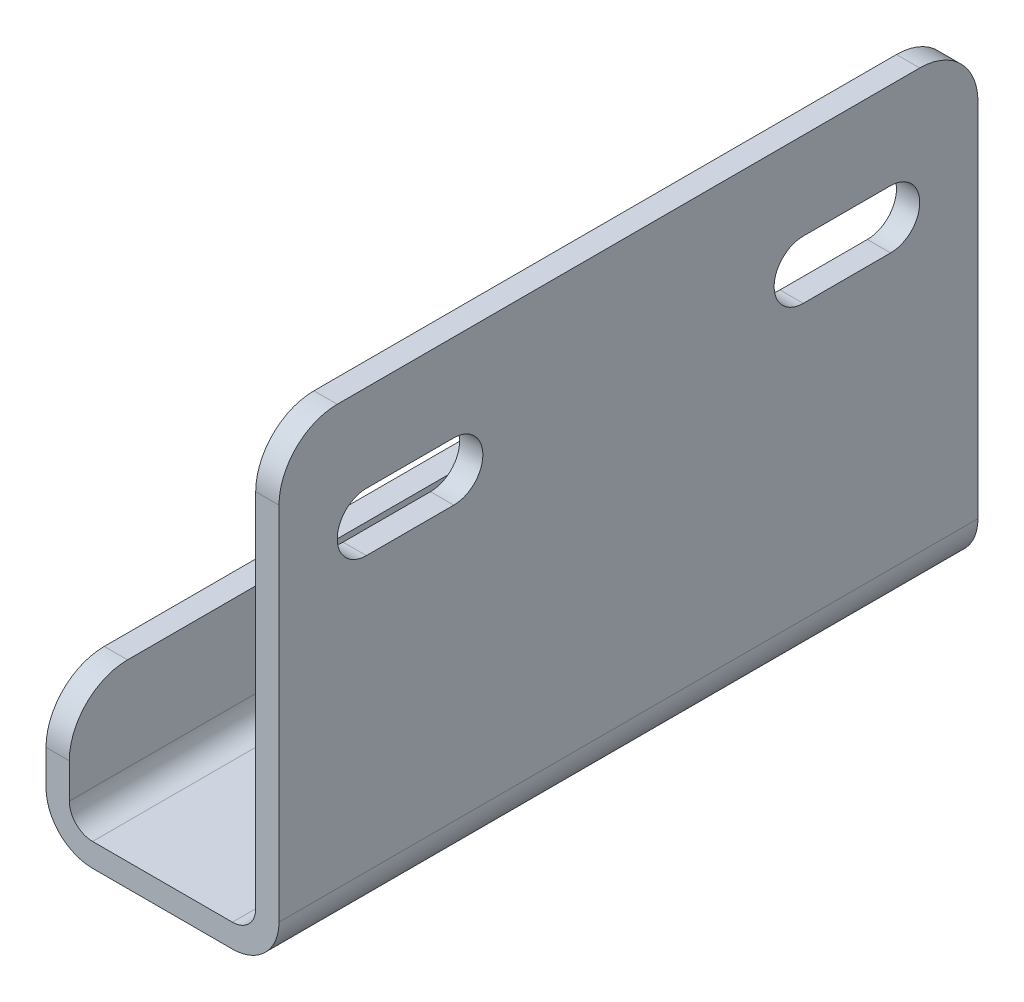
ISO-10303-21;
HEADER;
FILE_DESCRIPTION(('STEP AP214'),'2;1');
FILE_NAME('part.step','',(''),(''),'','','');
FILE_SCHEMA(('AUTOMOTIVE_DESIGN { 1 0 10303 214 1 1 1 1 }'));
ENDSEC;
DATA;
#1=APPLICATION_CONTEXT('core data for automotive mechanical design processes');
#2=APPLICATION_PROTOCOL_DEFINITION('international standard','automotive_design',2000,#1);
#3=PRODUCT_CONTEXT('',#1,'mechanical');
#4=PRODUCT('Part','Part','',(#3));
#5=PRODUCT_RELATED_PRODUCT_CATEGORY('part','',(#4));
#6=PRODUCT_DEFINITION_FORMATION('','',#4);
#7=PRODUCT_DEFINITION_CONTEXT('part definition',#1,'design');
#8=PRODUCT_DEFINITION('design','',#6,#7);
#9=PRODUCT_DEFINITION_SHAPE('','',#8);
#10=(LENGTH_UNIT() NAMED_UNIT(*) SI_UNIT(.MILLI.,.METRE.));
#11=(NAMED_UNIT(*) PLANE_ANGLE_UNIT() SI_UNIT($,.RADIAN.));
#12=(NAMED_UNIT(*) SI_UNIT($,.STERADIAN.) SOLID_ANGLE_UNIT());
#13=UNCERTAINTY_MEASURE_WITH_UNIT(LENGTH_MEASURE(1.E-05),#10,'distance_accuracy_value','');
#14=(GEOMETRIC_REPRESENTATION_CONTEXT(3) GLOBAL_UNCERTAINTY_ASSIGNED_CONTEXT((#13)) GLOBAL_UNIT_ASSIGNED_CONTEXT((#10,
#11,#12)) REPRESENTATION_CONTEXT('',''));
#15=CARTESIAN_POINT('',(0.,0.,0.));
#16=DIRECTION('',(0.,0.,1.));
#17=DIRECTION('',(1.,0.,0.));
#18=AXIS2_PLACEMENT_3D('',#15,#16,#17);
#19=CARTESIAN_POINT('',(-20.32,0.,38.1));
#20=DIRECTION('',(0.,-1.,0.));
#21=DIRECTION('',(0.,0.,-1.));
#22=AXIS2_PLACEMENT_3D('',#19,#20,#21);
#23=PLANE('',#22);
#24=CARTESIAN_POINT('',(-10.16,0.,-25.));
#25=DIRECTION('',(0.,1.,0.));
#26=DIRECTION('',(0.,0.,1.));
#27=AXIS2_PLACEMENT_3D('',#24,#25,#26);
#28=CIRCLE('',#27,1.5);
#29=CARTESIAN_POINT('',(-10.16,0.,-23.5));
#30=VERTEX_POINT('',#29);
#31=EDGE_CURVE('E477',#30,#30,#28,.T.);
#32=ORIENTED_EDGE('',*,*,#31,.F.);
#33=EDGE_LOOP('',(#32));
#34=FACE_BOUND('',#33,.T.);
#35=CARTESIAN_POINT('',(-10.1600000000002,0.,25.));
#36=DIRECTION('',(0.,1.,0.));
#37=DIRECTION('',(0.,0.,-1.));
#38=AXIS2_PLACEMENT_3D('',#35,#36,#37);
#39=CIRCLE('',#38,1.5);
#40=CARTESIAN_POINT('',(-10.1600000000002,0.,23.5));
#41=VERTEX_POINT('',#40);
#42=EDGE_CURVE('E245',#41,#41,#39,.T.);
#43=ORIENTED_EDGE('',*,*,#42,.F.);
#44=EDGE_LOOP('',(#43));
#45=FACE_BOUND('',#44,.T.);
#46=DIRECTION('',(-1.,0.,0.));
#47=VECTOR('',#46,1.);
#48=CARTESIAN_POINT('',(-20.32,0.,38.1));
#49=LINE('',#48,#47);
#50=CARTESIAN_POINT('',(-2.54,0.,38.1));
#51=VERTEX_POINT('',#50);
#52=CARTESIAN_POINT('',(-17.78,0.,38.1));
#53=VERTEX_POINT('',#52);
#54=EDGE_CURVE('E288',#51,#53,#49,.T.);
#55=ORIENTED_EDGE('',*,*,#54,.F.);
#56=DIRECTION('',(0.,0.,-1.));
#57=VECTOR('',#56,1.);
#58=CARTESIAN_POINT('',(-2.54,0.,-38.1));
#59=LINE('',#58,#57);
#60=CARTESIAN_POINT('',(-2.54,0.,-38.1));
#61=VERTEX_POINT('',#60);
#62=EDGE_CURVE('E431',#51,#61,#59,.T.);
#63=ORIENTED_EDGE('',*,*,#62,.T.);
#64=DIRECTION('',(-1.,0.,0.));
#65=VECTOR('',#64,1.);
#66=CARTESIAN_POINT('',(-20.32,0.,-38.1));
#67=LINE('',#66,#65);
#68=CARTESIAN_POINT('',(-17.78,0.,-38.1));
#69=VERTEX_POINT('',#68);
#70=EDGE_CURVE('E255',#61,#69,#67,.T.);
#71=ORIENTED_EDGE('',*,*,#70,.T.);
#72=DIRECTION('',(0.,0.,-1.));
#73=VECTOR('',#72,1.);
#74=CARTESIAN_POINT('',(-17.78,0.,38.1));
#75=LINE('',#74,#73);
#76=EDGE_CURVE('E428',#69,#53,#75,.F.);
#77=ORIENTED_EDGE('',*,*,#76,.T.);
#78=EDGE_LOOP('',(#55,#63,#71,#77));
#79=FACE_BOUND('',#78,.T.);
#80=ADVANCED_FACE('F43',(#34,#45,#79),#23,.F.);
#81=CARTESIAN_POINT('',(-20.32,12.7,38.1));
#82=DIRECTION('',(-1.,0.,0.));
#83=DIRECTION('',(0.,-1.,0.));
#84=AXIS2_PLACEMENT_3D('',#81,#82,#83);
#85=PLANE('',#84);
#86=DIRECTION('',(0.,1.,0.));
#87=VECTOR('',#86,1.);
#88=CARTESIAN_POINT('',(-20.32,12.7,38.1));
#89=LINE('',#88,#87);
#90=CARTESIAN_POINT('',(-20.32,2.54,38.1));
#91=VERTEX_POINT('',#90);
#92=CARTESIAN_POINT('',(-20.32,6.35,38.1));
#93=VERTEX_POINT('',#92);
#94=EDGE_CURVE('E292',#91,#93,#89,.T.);
#95=ORIENTED_EDGE('',*,*,#94,.F.);
#96=DIRECTION('',(0.,0.,-1.));
#97=VECTOR('',#96,1.);
#98=CARTESIAN_POINT('',(-20.32,2.54,-38.1));
#99=LINE('',#98,#97);
#100=CARTESIAN_POINT('',(-20.32,2.54,-38.1));
#101=VERTEX_POINT('',#100);
#102=EDGE_CURVE('E438',#91,#101,#99,.T.);
#103=ORIENTED_EDGE('',*,*,#102,.T.);
#104=DIRECTION('',(0.,1.,0.));
#105=VECTOR('',#104,1.);
#106=CARTESIAN_POINT('',(-20.32,12.7,-38.1));
#107=LINE('',#106,#105);
#108=CARTESIAN_POINT('',(-20.32,6.35,-38.1));
#109=VERTEX_POINT('',#108);
#110=EDGE_CURVE('E313',#101,#109,#107,.T.);
#111=ORIENTED_EDGE('',*,*,#110,.T.);
#112=CARTESIAN_POINT('',(-20.32,6.35,-31.75));
#113=DIRECTION('',(-1.,0.,0.));
#114=DIRECTION('',(0.,-1.,0.));
#115=AXIS2_PLACEMENT_3D('',#112,#113,#114);
#116=CIRCLE('',#115,6.35);
#117=CARTESIAN_POINT('',(-20.32,12.7,-31.75));
#118=VERTEX_POINT('',#117);
#119=EDGE_CURVE('E393',#109,#118,#116,.F.);
#120=ORIENTED_EDGE('',*,*,#119,.T.);
#121=DIRECTION('',(0.,0.,-1.));
#122=VECTOR('',#121,1.);
#123=CARTESIAN_POINT('',(-20.32,12.7,38.1));
#124=LINE('',#123,#122);
#125=CARTESIAN_POINT('',(-20.32,12.7,31.75));
#126=VERTEX_POINT('',#125);
#127=EDGE_CURVE('E339',#126,#118,#124,.T.);
#128=ORIENTED_EDGE('',*,*,#127,.F.);
#129=CARTESIAN_POINT('',(-20.32,6.35,31.75));
#130=DIRECTION('',(-1.,0.,0.));
#131=DIRECTION('',(0.,-1.,0.));
#132=AXIS2_PLACEMENT_3D('',#129,#130,#131);
#133=CIRCLE('',#132,6.35);
#134=EDGE_CURVE('E396',#126,#93,#133,.F.);
#135=ORIENTED_EDGE('',*,*,#134,.T.);
#136=EDGE_LOOP('',(#95,#103,#111,#120,#128,#135));
#137=FACE_BOUND('',#136,.T.);
#138=ADVANCED_FACE('F495',(#137),#85,.F.);
#139=CARTESIAN_POINT('',(-22.86,12.7,38.1));
#140=DIRECTION('',(0.,-1.,0.));
#141=DIRECTION('',(0.,0.,-1.));
#142=AXIS2_PLACEMENT_3D('',#139,#140,#141);
#143=PLANE('',#142);
#144=DIRECTION('',(0.,0.,-1.));
#145=VECTOR('',#144,1.);
#146=CARTESIAN_POINT('',(-22.86,12.7,38.1));
#147=LINE('',#146,#145);
#148=CARTESIAN_POINT('',(-22.86,12.7,31.75));
#149=VERTEX_POINT('',#148);
#150=CARTESIAN_POINT('',(-22.86,12.7,-31.75));
#151=VERTEX_POINT('',#150);
#152=EDGE_CURVE('E335',#149,#151,#147,.T.);
#153=ORIENTED_EDGE('',*,*,#152,.F.);
#154=DIRECTION('',(-1.,0.,0.));
#155=VECTOR('',#154,1.);
#156=CARTESIAN_POINT('',(-20.32,12.7,31.75));
#157=LINE('',#156,#155);
#158=EDGE_CURVE('E390',#149,#126,#157,.F.);
#159=ORIENTED_EDGE('',*,*,#158,.T.);
#160=ORIENTED_EDGE('',*,*,#127,.T.);
#161=DIRECTION('',(-1.,0.,0.));
#162=VECTOR('',#161,1.);
#163=CARTESIAN_POINT('',(-22.86,12.7,-31.75));
#164=LINE('',#163,#162);
#165=EDGE_CURVE('E386',#118,#151,#164,.T.);
#166=ORIENTED_EDGE('',*,*,#165,.T.);
#167=EDGE_LOOP('',(#153,#159,#160,#166));
#168=FACE_BOUND('',#167,.T.);
#169=ADVANCED_FACE('F550',(#168),#143,.F.);
#170=CARTESIAN_POINT('',(-22.86,-2.54,38.1));
#171=DIRECTION('',(1.,0.,0.));
#172=DIRECTION('',(0.,0.,-1.));
#173=AXIS2_PLACEMENT_3D('',#170,#171,#172);
#174=PLANE('',#173);
#175=DIRECTION('',(0.,-1.,0.));
#176=VECTOR('',#175,1.);
#177=CARTESIAN_POINT('',(-22.86,-2.54,-38.1));
#178=LINE('',#177,#176);
#179=CARTESIAN_POINT('',(-22.86,6.35,-38.1));
#180=VERTEX_POINT('',#179);
#181=CARTESIAN_POINT('',(-22.86,2.54,-38.1));
#182=VERTEX_POINT('',#181);
#183=EDGE_CURVE('E316',#180,#182,#178,.T.);
#184=ORIENTED_EDGE('',*,*,#183,.T.);
#185=DIRECTION('',(0.,0.,-1.));
#186=VECTOR('',#185,1.);
#187=CARTESIAN_POINT('',(-22.86,2.54,38.1));
#188=LINE('',#187,#186);
#189=CARTESIAN_POINT('',(-22.86,2.54,38.1));
#190=VERTEX_POINT('',#189);
#191=EDGE_CURVE('E11',#182,#190,#188,.F.);
#192=ORIENTED_EDGE('',*,*,#191,.T.);
#193=DIRECTION('',(0.,-1.,0.));
#194=VECTOR('',#193,1.);
#195=CARTESIAN_POINT('',(-22.86,0.,38.1));
#196=LINE('',#195,#194);
#197=CARTESIAN_POINT('',(-22.86,6.35,38.1));
#198=VERTEX_POINT('',#197);
#199=EDGE_CURVE('E296',#198,#190,#196,.T.);
#200=ORIENTED_EDGE('',*,*,#199,.F.);
#201=CARTESIAN_POINT('',(-22.86,6.35,31.75));
#202=DIRECTION('',(1.,0.,0.));
#203=DIRECTION('',(0.,0.,-1.));
#204=AXIS2_PLACEMENT_3D('',#201,#202,#203);
#205=CIRCLE('',#204,6.35);
#206=EDGE_CURVE('E383',#198,#149,#205,.F.);
#207=ORIENTED_EDGE('',*,*,#206,.T.);
#208=ORIENTED_EDGE('',*,*,#152,.T.);
#209=CARTESIAN_POINT('',(-22.86,6.35,-31.75));
#210=DIRECTION('',(1.,0.,0.));
#211=DIRECTION('',(0.,0.,-1.));
#212=AXIS2_PLACEMENT_3D('',#209,#210,#211);
#213=CIRCLE('',#212,6.35);
#214=EDGE_CURVE('E380',#151,#180,#213,.F.);
#215=ORIENTED_EDGE('',*,*,#214,.T.);
#216=EDGE_LOOP('',(#184,#192,#200,#207,#208,#215));
#217=FACE_BOUND('',#216,.T.);
#218=ADVANCED_FACE('F543',(#217),#174,.F.);
#219=CARTESIAN_POINT('',(2.54,-2.54,38.1));
#220=DIRECTION('',(0.,1.,0.));
#221=DIRECTION('',(-1.,0.,0.));
#222=AXIS2_PLACEMENT_3D('',#219,#220,#221);
#223=PLANE('',#222);
#224=CARTESIAN_POINT('',(-10.16,-2.54,-25.));
#225=DIRECTION('',(0.,1.,0.));
#226=DIRECTION('',(-1.,0.,0.));
#227=AXIS2_PLACEMENT_3D('',#224,#225,#226);
#228=CIRCLE('',#227,1.5);
#229=CARTESIAN_POINT('',(-11.66,-2.54,-25.));
#230=VERTEX_POINT('',#229);
#231=EDGE_CURVE('E47',#230,#230,#228,.T.);
#232=ORIENTED_EDGE('',*,*,#231,.T.);
#233=EDGE_LOOP('',(#232));
#234=FACE_BOUND('',#233,.T.);
#235=CARTESIAN_POINT('',(-10.1600000000002,-2.54,25.));
#236=DIRECTION('',(0.,1.,0.));
#237=DIRECTION('',(-1.,0.,0.));
#238=AXIS2_PLACEMENT_3D('',#235,#236,#237);
#239=CIRCLE('',#238,1.5);
#240=CARTESIAN_POINT('',(-11.6600000000002,-2.54,25.));
#241=VERTEX_POINT('',#240);
#242=EDGE_CURVE('E474',#241,#241,#239,.T.);
#243=ORIENTED_EDGE('',*,*,#242,.T.);
#244=EDGE_LOOP('',(#243));
#245=FACE_BOUND('',#244,.T.);
#246=DIRECTION('',(1.,0.,0.));
#247=VECTOR('',#246,1.);
#248=CARTESIAN_POINT('',(2.54,-2.54,-38.1));
#249=LINE('',#248,#247);
#250=CARTESIAN_POINT('',(-17.78,-2.54,-38.1));
#251=VERTEX_POINT('',#250);
#252=CARTESIAN_POINT('',(-2.54,-2.54,-38.1));
#253=VERTEX_POINT('',#252);
#254=EDGE_CURVE('E319',#251,#253,#249,.T.);
#255=ORIENTED_EDGE('',*,*,#254,.T.);
#256=DIRECTION('',(0.,0.,-1.));
#257=VECTOR('',#256,1.);
#258=CARTESIAN_POINT('',(-2.54,-2.54,38.1));
#259=LINE('',#258,#257);
#260=CARTESIAN_POINT('',(-2.54,-2.54,38.1));
#261=VERTEX_POINT('',#260);
#262=EDGE_CURVE('E67',#253,#261,#259,.F.);
#263=ORIENTED_EDGE('',*,*,#262,.T.);
#264=DIRECTION('',(1.,0.,0.));
#265=VECTOR('',#264,1.);
#266=CARTESIAN_POINT('',(2.54,-2.54,38.1));
#267=LINE('',#266,#265);
#268=CARTESIAN_POINT('',(-17.78,-2.54,38.1));
#269=VERTEX_POINT('',#268);
#270=EDGE_CURVE('E299',#269,#261,#267,.T.);
#271=ORIENTED_EDGE('',*,*,#270,.F.);
#272=DIRECTION('',(0.,0.,-1.));
#273=VECTOR('',#272,1.);
#274=CARTESIAN_POINT('',(-17.78,-2.54,38.1));
#275=LINE('',#274,#273);
#276=EDGE_CURVE('E464',#269,#251,#275,.T.);
#277=ORIENTED_EDGE('',*,*,#276,.T.);
#278=EDGE_LOOP('',(#255,#263,#271,#277));
#279=FACE_BOUND('',#278,.T.);
#280=ADVANCED_FACE('F537',(#234,#245,#279),#223,.F.);
#281=CARTESIAN_POINT('',(2.54,48.26,38.1));
#282=DIRECTION('',(-1.,0.,0.));
#283=DIRECTION('',(0.,-1.,0.));
#284=AXIS2_PLACEMENT_3D('',#281,#282,#283);
#285=PLANE('',#284);
#286=DIRECTION('',(0.,0.,-1.));
#287=VECTOR('',#286,1.);
#288=CARTESIAN_POINT('',(2.54,38.735,-28.575));
#289=LINE('',#288,#287);
#290=CARTESIAN_POINT('',(2.54,38.735,-19.05));
#291=VERTEX_POINT('',#290);
#292=CARTESIAN_POINT('',(2.54,38.735,-28.575));
#293=VERTEX_POINT('',#292);
#294=EDGE_CURVE('E222',#291,#293,#289,.T.);
#295=ORIENTED_EDGE('',*,*,#294,.T.);
#296=CARTESIAN_POINT('',(2.54,35.56,-28.575));
#297=DIRECTION('',(-1.,0.,0.));
#298=DIRECTION('',(0.,0.,1.));
#299=AXIS2_PLACEMENT_3D('',#296,#297,#298);
#300=CIRCLE('',#299,3.175);
#301=CARTESIAN_POINT('',(2.54,32.385,-28.575));
#302=VERTEX_POINT('',#301);
#303=EDGE_CURVE('E214',#293,#302,#300,.T.);
#304=ORIENTED_EDGE('',*,*,#303,.T.);
#305=DIRECTION('',(0.,0.,1.));
#306=VECTOR('',#305,1.);
#307=CARTESIAN_POINT('',(2.54,32.385,-28.575));
#308=LINE('',#307,#306);
#309=CARTESIAN_POINT('',(2.54,32.385,-19.05));
#310=VERTEX_POINT('',#309);
#311=EDGE_CURVE('E226',#302,#310,#308,.T.);
#312=ORIENTED_EDGE('',*,*,#311,.T.);
#313=CARTESIAN_POINT('',(2.54,35.56,-19.05));
#314=DIRECTION('',(-1.,0.,0.));
#315=DIRECTION('',(0.,0.,1.));
#316=AXIS2_PLACEMENT_3D('',#313,#314,#315);
#317=CIRCLE('',#316,3.175);
#318=EDGE_CURVE('E232',#310,#291,#317,.T.);
#319=ORIENTED_EDGE('',*,*,#318,.T.);
#320=EDGE_LOOP('',(#295,#304,#312,#319));
#321=FACE_BOUND('',#320,.T.);
#322=DIRECTION('',(0.,0.,-1.));
#323=VECTOR('',#322,1.);
#324=CARTESIAN_POINT('',(2.54,38.735,19.05));
#325=LINE('',#324,#323);
#326=CARTESIAN_POINT('',(2.54,38.735,28.575));
#327=VERTEX_POINT('',#326);
#328=CARTESIAN_POINT('',(2.54,38.735,19.05));
#329=VERTEX_POINT('',#328);
#330=EDGE_CURVE('E274',#327,#329,#325,.T.);
#331=ORIENTED_EDGE('',*,*,#330,.T.);
#332=CARTESIAN_POINT('',(2.54,35.56,19.05));
#333=DIRECTION('',(-1.,0.,0.));
#334=DIRECTION('',(0.,0.,1.));
#335=AXIS2_PLACEMENT_3D('',#332,#333,#334);
#336=CIRCLE('',#335,3.175);
#337=CARTESIAN_POINT('',(2.54,32.385,19.05));
#338=VERTEX_POINT('',#337);
#339=EDGE_CURVE('E262',#329,#338,#336,.T.);
#340=ORIENTED_EDGE('',*,*,#339,.T.);
#341=DIRECTION('',(0.,0.,1.));
#342=VECTOR('',#341,1.);
#343=CARTESIAN_POINT('',(2.54,32.385,19.05));
#344=LINE('',#343,#342);
#345=CARTESIAN_POINT('',(2.54,32.385,28.575));
#346=VERTEX_POINT('',#345);
#347=EDGE_CURVE('E266',#338,#346,#344,.T.);
#348=ORIENTED_EDGE('',*,*,#347,.T.);
#349=CARTESIAN_POINT('',(2.54,35.56,28.575));
#350=DIRECTION('',(-1.,0.,0.));
#351=DIRECTION('',(0.,0.,1.));
#352=AXIS2_PLACEMENT_3D('',#349,#350,#351);
#353=CIRCLE('',#352,3.175);
#354=EDGE_CURVE('E270',#346,#327,#353,.T.);
#355=ORIENTED_EDGE('',*,*,#354,.T.);
#356=EDGE_LOOP('',(#331,#340,#348,#355));
#357=FACE_BOUND('',#356,.T.);
#358=DIRECTION('',(0.,1.,0.));
#359=VECTOR('',#358,1.);
#360=CARTESIAN_POINT('',(2.54,48.26,38.1));
#361=LINE('',#360,#359);
#362=CARTESIAN_POINT('',(2.54,2.54,38.1));
#363=VERTEX_POINT('',#362);
#364=CARTESIAN_POINT('',(2.54,41.91,38.1));
#365=VERTEX_POINT('',#364);
#366=EDGE_CURVE('E302',#363,#365,#361,.T.);
#367=ORIENTED_EDGE('',*,*,#366,.F.);
#368=DIRECTION('',(0.,0.,-1.));
#369=VECTOR('',#368,1.);
#370=CARTESIAN_POINT('',(2.54,2.54,38.1));
#371=LINE('',#370,#369);
#372=CARTESIAN_POINT('',(2.54,2.54,-38.1));
#373=VERTEX_POINT('',#372);
#374=EDGE_CURVE('E454',#363,#373,#371,.T.);
#375=ORIENTED_EDGE('',*,*,#374,.T.);
#376=DIRECTION('',(0.,1.,0.));
#377=VECTOR('',#376,1.);
#378=CARTESIAN_POINT('',(2.54,48.26,-38.1));
#379=LINE('',#378,#377);
#380=CARTESIAN_POINT('',(2.54,41.91,-38.1));
#381=VERTEX_POINT('',#380);
#382=EDGE_CURVE('E322',#373,#381,#379,.T.);
#383=ORIENTED_EDGE('',*,*,#382,.T.);
#384=CARTESIAN_POINT('',(2.54,41.91,-31.75));
#385=DIRECTION('',(-1.,0.,0.));
#386=DIRECTION('',(0.,-1.,0.));
#387=AXIS2_PLACEMENT_3D('',#384,#385,#386);
#388=CIRCLE('',#387,6.35);
#389=CARTESIAN_POINT('',(2.54,48.26,-31.75));
#390=VERTEX_POINT('',#389);
#391=EDGE_CURVE('E425',#381,#390,#388,.F.);
#392=ORIENTED_EDGE('',*,*,#391,.T.);
#393=DIRECTION('',(0.,0.,-1.));
#394=VECTOR('',#393,1.);
#395=CARTESIAN_POINT('',(2.54,48.26,38.1));
#396=LINE('',#395,#394);
#397=CARTESIAN_POINT('',(2.54,48.26,31.75));
#398=VERTEX_POINT('',#397);
#399=EDGE_CURVE('E331',#398,#390,#396,.T.);
#400=ORIENTED_EDGE('',*,*,#399,.F.);
#401=CARTESIAN_POINT('',(2.54,41.91,31.75));
#402=DIRECTION('',(-1.,0.,0.));
#403=DIRECTION('',(0.,-1.,0.));
#404=AXIS2_PLACEMENT_3D('',#401,#402,#403);
#405=CIRCLE('',#404,6.35);
#406=EDGE_CURVE('E421',#398,#365,#405,.F.);
#407=ORIENTED_EDGE('',*,*,#406,.T.);
#408=EDGE_LOOP('',(#367,#375,#383,#392,#400,#407));
#409=FACE_BOUND('',#408,.T.);
#410=ADVANCED_FACE('F234',(#321,#357,#409),#285,.F.);
#411=CARTESIAN_POINT('',(0.,48.26,38.1));
#412=DIRECTION('',(0.,-1.,0.));
#413=DIRECTION('',(0.,0.,-1.));
#414=AXIS2_PLACEMENT_3D('',#411,#412,#413);
#415=PLANE('',#414);
#416=ORIENTED_EDGE('',*,*,#399,.T.);
#417=DIRECTION('',(-1.,0.,0.));
#418=VECTOR('',#417,1.);
#419=CARTESIAN_POINT('',(0.,48.26,-31.75));
#420=LINE('',#419,#418);
#421=CARTESIAN_POINT('',(0.,48.26,-31.75));
#422=VERTEX_POINT('',#421);
#423=EDGE_CURVE('E411',#390,#422,#420,.T.);
#424=ORIENTED_EDGE('',*,*,#423,.T.);
#425=DIRECTION('',(0.,0.,-1.));
#426=VECTOR('',#425,1.);
#427=CARTESIAN_POINT('',(0.,48.26,38.1));
#428=LINE('',#427,#426);
#429=CARTESIAN_POINT('',(0.,48.26,31.75));
#430=VERTEX_POINT('',#429);
#431=EDGE_CURVE('E309',#430,#422,#428,.T.);
#432=ORIENTED_EDGE('',*,*,#431,.F.);
#433=DIRECTION('',(-1.,0.,0.));
#434=VECTOR('',#433,1.);
#435=CARTESIAN_POINT('',(2.54,48.26,31.75));
#436=LINE('',#435,#434);
#437=EDGE_CURVE('E408',#430,#398,#436,.F.);
#438=ORIENTED_EDGE('',*,*,#437,.T.);
#439=EDGE_LOOP('',(#416,#424,#432,#438));
#440=FACE_BOUND('',#439,.T.);
#441=ADVANCED_FACE('F522',(#440),#415,.F.);
#442=CARTESIAN_POINT('',(0.,0.,38.1));
#443=DIRECTION('',(1.,0.,0.));
#444=DIRECTION('',(0.,0.,-1.));
#445=AXIS2_PLACEMENT_3D('',#442,#443,#444);
#446=PLANE('',#445);
#447=DIRECTION('',(0.,0.,-1.));
#448=VECTOR('',#447,1.);
#449=CARTESIAN_POINT('',(0.,32.3849999999999,38.1));
#450=LINE('',#449,#448);
#451=CARTESIAN_POINT('',(0.,32.385,-19.05));
#452=VERTEX_POINT('',#451);
#453=CARTESIAN_POINT('',(0.,32.385,-28.575));
#454=VERTEX_POINT('',#453);
#455=EDGE_CURVE('E359',#452,#454,#450,.T.);
#456=ORIENTED_EDGE('',*,*,#455,.T.);
#457=CARTESIAN_POINT('',(0.,35.56,-28.575));
#458=DIRECTION('',(1.,0.,0.));
#459=DIRECTION('',(0.,0.,-1.));
#460=AXIS2_PLACEMENT_3D('',#457,#458,#459);
#461=CIRCLE('',#460,3.175);
#462=CARTESIAN_POINT('',(0.,38.735,-28.575));
#463=VERTEX_POINT('',#462);
#464=EDGE_CURVE('E217',#454,#463,#461,.T.);
#465=ORIENTED_EDGE('',*,*,#464,.T.);
#466=DIRECTION('',(0.,0.,1.));
#467=VECTOR('',#466,1.);
#468=CARTESIAN_POINT('',(0.,38.735,38.1));
#469=LINE('',#468,#467);
#470=CARTESIAN_POINT('',(0.,38.735,-19.05));
#471=VERTEX_POINT('',#470);
#472=EDGE_CURVE('E366',#463,#471,#469,.T.);
#473=ORIENTED_EDGE('',*,*,#472,.T.);
#474=CARTESIAN_POINT('',(0.,35.56,-19.05));
#475=DIRECTION('',(1.,0.,0.));
#476=DIRECTION('',(0.,0.,-1.));
#477=AXIS2_PLACEMENT_3D('',#474,#475,#476);
#478=CIRCLE('',#477,3.175);
#479=EDGE_CURVE('E362',#471,#452,#478,.T.);
#480=ORIENTED_EDGE('',*,*,#479,.T.);
#481=EDGE_LOOP('',(#456,#465,#473,#480));
#482=FACE_BOUND('',#481,.T.);
#483=DIRECTION('',(0.,0.,-1.));
#484=VECTOR('',#483,1.);
#485=CARTESIAN_POINT('',(0.,32.385,38.1));
#486=LINE('',#485,#484);
#487=CARTESIAN_POINT('',(0.,32.385,28.575));
#488=VERTEX_POINT('',#487);
#489=CARTESIAN_POINT('',(0.,32.385,19.05));
#490=VERTEX_POINT('',#489);
#491=EDGE_CURVE('E343',#488,#490,#486,.T.);
#492=ORIENTED_EDGE('',*,*,#491,.T.);
#493=CARTESIAN_POINT('',(0.,35.56,19.05));
#494=DIRECTION('',(1.,0.,0.));
#495=DIRECTION('',(0.,0.,-1.));
#496=AXIS2_PLACEMENT_3D('',#493,#494,#495);
#497=CIRCLE('',#496,3.175);
#498=CARTESIAN_POINT('',(0.,38.735,19.05));
#499=VERTEX_POINT('',#498);
#500=EDGE_CURVE('E355',#490,#499,#497,.T.);
#501=ORIENTED_EDGE('',*,*,#500,.T.);
#502=DIRECTION('',(0.,0.,1.));
#503=VECTOR('',#502,1.);
#504=CARTESIAN_POINT('',(0.,38.735,38.1));
#505=LINE('',#504,#503);
#506=CARTESIAN_POINT('',(0.,38.735,28.575));
#507=VERTEX_POINT('',#506);
#508=EDGE_CURVE('E351',#499,#507,#505,.T.);
#509=ORIENTED_EDGE('',*,*,#508,.T.);
#510=CARTESIAN_POINT('',(0.,35.56,28.575));
#511=DIRECTION('',(1.,0.,0.));
#512=DIRECTION('',(0.,0.,-1.));
#513=AXIS2_PLACEMENT_3D('',#510,#511,#512);
#514=CIRCLE('',#513,3.175);
#515=EDGE_CURVE('E347',#507,#488,#514,.T.);
#516=ORIENTED_EDGE('',*,*,#515,.T.);
#517=EDGE_LOOP('',(#492,#501,#509,#516));
#518=FACE_BOUND('',#517,.T.);
#519=DIRECTION('',(0.,-1.,0.));
#520=VECTOR('',#519,1.);
#521=CARTESIAN_POINT('',(0.,0.,-38.1));
#522=LINE('',#521,#520);
#523=CARTESIAN_POINT('',(0.,41.91,-38.1));
#524=VERTEX_POINT('',#523);
#525=CARTESIAN_POINT('',(0.,2.54,-38.1));
#526=VERTEX_POINT('',#525);
#527=EDGE_CURVE('E293',#524,#526,#522,.T.);
#528=ORIENTED_EDGE('',*,*,#527,.T.);
#529=DIRECTION('',(0.,0.,-1.));
#530=VECTOR('',#529,1.);
#531=CARTESIAN_POINT('',(0.,2.54,38.1));
#532=LINE('',#531,#530);
#533=CARTESIAN_POINT('',(0.,2.54,38.1));
#534=VERTEX_POINT('',#533);
#535=EDGE_CURVE('E435',#526,#534,#532,.F.);
#536=ORIENTED_EDGE('',*,*,#535,.T.);
#537=DIRECTION('',(0.,-1.,0.));
#538=VECTOR('',#537,1.);
#539=CARTESIAN_POINT('',(0.,0.,38.1));
#540=LINE('',#539,#538);
#541=CARTESIAN_POINT('',(0.,41.91,38.1));
#542=VERTEX_POINT('',#541);
#543=EDGE_CURVE('E305',#542,#534,#540,.T.);
#544=ORIENTED_EDGE('',*,*,#543,.F.);
#545=CARTESIAN_POINT('',(0.,41.91,31.75));
#546=DIRECTION('',(1.,0.,0.));
#547=DIRECTION('',(0.,0.,-1.));
#548=AXIS2_PLACEMENT_3D('',#545,#546,#547);
#549=CIRCLE('',#548,6.35);
#550=EDGE_CURVE('E415',#542,#430,#549,.F.);
#551=ORIENTED_EDGE('',*,*,#550,.T.);
#552=ORIENTED_EDGE('',*,*,#431,.T.);
#553=CARTESIAN_POINT('',(0.,41.91,-31.75));
#554=DIRECTION('',(1.,0.,0.));
#555=DIRECTION('',(0.,0.,-1.));
#556=AXIS2_PLACEMENT_3D('',#553,#554,#555);
#557=CIRCLE('',#556,6.35);
#558=EDGE_CURVE('E418',#422,#524,#557,.F.);
#559=ORIENTED_EDGE('',*,*,#558,.T.);
#560=EDGE_LOOP('',(#528,#536,#544,#551,#552,#559));
#561=FACE_BOUND('',#560,.T.);
#562=ADVANCED_FACE('F514',(#482,#518,#561),#446,.F.);
#563=CARTESIAN_POINT('',(0.,0.,38.1));
#564=DIRECTION('',(0.,0.,1.));
#565=DIRECTION('',(1.,0.,0.));
#566=AXIS2_PLACEMENT_3D('',#563,#564,#565);
#567=PLANE('',#566);
#568=ORIENTED_EDGE('',*,*,#270,.T.);
#569=CARTESIAN_POINT('',(-2.54,2.54,38.1));
#570=DIRECTION('',(0.,0.,1.));
#571=DIRECTION('',(1.,0.,0.));
#572=AXIS2_PLACEMENT_3D('',#569,#570,#571);
#573=CIRCLE('',#572,5.08);
#574=EDGE_CURVE('E53',#261,#363,#573,.T.);
#575=ORIENTED_EDGE('',*,*,#574,.T.);
#576=ORIENTED_EDGE('',*,*,#366,.T.);
#577=DIRECTION('',(-1.,0.,0.));
#578=VECTOR('',#577,1.);
#579=CARTESIAN_POINT('',(0.,41.91,38.1));
#580=LINE('',#579,#578);
#581=EDGE_CURVE('E372',#365,#542,#580,.T.);
#582=ORIENTED_EDGE('',*,*,#581,.T.);
#583=ORIENTED_EDGE('',*,*,#543,.T.);
#584=CARTESIAN_POINT('',(-2.54,2.54,38.1));
#585=DIRECTION('',(0.,0.,1.));
#586=DIRECTION('',(1.,0.,0.));
#587=AXIS2_PLACEMENT_3D('',#584,#585,#586);
#588=CIRCLE('',#587,2.54);
#589=EDGE_CURVE('E445',#534,#51,#588,.F.);
#590=ORIENTED_EDGE('',*,*,#589,.T.);
#591=ORIENTED_EDGE('',*,*,#54,.T.);
#592=CARTESIAN_POINT('',(-17.78,2.54,38.1));
#593=DIRECTION('',(0.,0.,1.));
#594=DIRECTION('',(1.,0.,0.));
#595=AXIS2_PLACEMENT_3D('',#592,#593,#594);
#596=CIRCLE('',#595,2.54);
#597=EDGE_CURVE('E451',#53,#91,#596,.F.);
#598=ORIENTED_EDGE('',*,*,#597,.T.);
#599=ORIENTED_EDGE('',*,*,#94,.T.);
#600=DIRECTION('',(-1.,0.,0.));
#601=VECTOR('',#600,1.);
#602=CARTESIAN_POINT('',(-22.86,6.35,38.1));
#603=LINE('',#602,#601);
#604=EDGE_CURVE('E376',#93,#198,#603,.T.);
#605=ORIENTED_EDGE('',*,*,#604,.T.);
#606=ORIENTED_EDGE('',*,*,#199,.T.);
#607=CARTESIAN_POINT('',(-17.78,2.54,38.1));
#608=DIRECTION('',(0.,0.,1.));
#609=DIRECTION('',(1.,0.,0.));
#610=AXIS2_PLACEMENT_3D('',#607,#608,#609);
#611=CIRCLE('',#610,5.08);
#612=EDGE_CURVE('E470',#190,#269,#611,.T.);
#613=ORIENTED_EDGE('',*,*,#612,.T.);
#614=EDGE_LOOP('',(#568,#575,#576,#582,#583,#590,#591,#598,#599,#605,#606,#613));
#615=FACE_BOUND('',#614,.T.);
#616=ADVANCED_FACE('F531',(#615),#567,.T.);
#617=CARTESIAN_POINT('',(0.,0.,-38.1));
#618=DIRECTION('',(0.,0.,1.));
#619=DIRECTION('',(1.,0.,0.));
#620=AXIS2_PLACEMENT_3D('',#617,#618,#619);
#621=PLANE('',#620);
#622=ORIENTED_EDGE('',*,*,#382,.F.);
#623=CARTESIAN_POINT('',(-2.54,2.54,-38.1));
#624=DIRECTION('',(0.,0.,1.));
#625=DIRECTION('',(1.,0.,0.));
#626=AXIS2_PLACEMENT_3D('',#623,#624,#625);
#627=CIRCLE('',#626,5.08);
#628=EDGE_CURVE('E461',#373,#253,#627,.F.);
#629=ORIENTED_EDGE('',*,*,#628,.T.);
#630=ORIENTED_EDGE('',*,*,#254,.F.);
#631=CARTESIAN_POINT('',(-17.78,2.54,-38.1));
#632=DIRECTION('',(0.,0.,1.));
#633=DIRECTION('',(1.,0.,0.));
#634=AXIS2_PLACEMENT_3D('',#631,#632,#633);
#635=CIRCLE('',#634,5.08);
#636=EDGE_CURVE('E458',#251,#182,#635,.F.);
#637=ORIENTED_EDGE('',*,*,#636,.T.);
#638=ORIENTED_EDGE('',*,*,#183,.F.);
#639=DIRECTION('',(-1.,0.,0.));
#640=VECTOR('',#639,1.);
#641=CARTESIAN_POINT('',(0.,6.35,-38.1));
#642=LINE('',#641,#640);
#643=EDGE_CURVE('E404',#180,#109,#642,.F.);
#644=ORIENTED_EDGE('',*,*,#643,.T.);
#645=ORIENTED_EDGE('',*,*,#110,.F.);
#646=CARTESIAN_POINT('',(-17.78,2.54,-38.1));
#647=DIRECTION('',(0.,0.,1.));
#648=DIRECTION('',(1.,0.,0.));
#649=AXIS2_PLACEMENT_3D('',#646,#647,#648);
#650=CIRCLE('',#649,2.54);
#651=EDGE_CURVE('E448',#101,#69,#650,.T.);
#652=ORIENTED_EDGE('',*,*,#651,.T.);
#653=ORIENTED_EDGE('',*,*,#70,.F.);
#654=CARTESIAN_POINT('',(-2.54,2.54,-38.1));
#655=DIRECTION('',(0.,0.,1.));
#656=DIRECTION('',(1.,0.,0.));
#657=AXIS2_PLACEMENT_3D('',#654,#655,#656);
#658=CIRCLE('',#657,2.54);
#659=EDGE_CURVE('E442',#61,#526,#658,.T.);
#660=ORIENTED_EDGE('',*,*,#659,.T.);
#661=ORIENTED_EDGE('',*,*,#527,.F.);
#662=DIRECTION('',(-1.,0.,0.));
#663=VECTOR('',#662,1.);
#664=CARTESIAN_POINT('',(0.,41.91,-38.1));
#665=LINE('',#664,#663);
#666=EDGE_CURVE('E400',#524,#381,#665,.F.);
#667=ORIENTED_EDGE('',*,*,#666,.T.);
#668=EDGE_LOOP('',(#622,#629,#630,#637,#638,#644,#645,#652,#653,#660,#661,#667));
#669=FACE_BOUND('',#668,.T.);
#670=ADVANCED_FACE('F511',(#669),#621,.F.);
#671=CARTESIAN_POINT('',(2.54,35.56,19.05));
#672=DIRECTION('',(-1.,0.,0.));
#673=DIRECTION('',(0.,0.,1.));
#674=AXIS2_PLACEMENT_3D('',#671,#672,#673);
#675=CYLINDRICAL_SURFACE('',#674,3.175);
#676=DIRECTION('',(-1.,0.,0.));
#677=VECTOR('',#676,1.);
#678=CARTESIAN_POINT('',(2.54,32.385,19.05));
#679=LINE('',#678,#677);
#680=EDGE_CURVE('E277',#338,#490,#679,.T.);
#681=ORIENTED_EDGE('',*,*,#680,.F.);
#682=ORIENTED_EDGE('',*,*,#339,.F.);
#683=DIRECTION('',(-1.,0.,0.));
#684=VECTOR('',#683,1.);
#685=CARTESIAN_POINT('',(2.54,38.735,19.05));
#686=LINE('',#685,#684);
#687=EDGE_CURVE('E238',#329,#499,#686,.T.);
#688=ORIENTED_EDGE('',*,*,#687,.T.);
#689=ORIENTED_EDGE('',*,*,#500,.F.);
#690=EDGE_LOOP('',(#681,#682,#688,#689));
#691=FACE_BOUND('',#690,.T.);
#692=ADVANCED_FACE('F597',(#691),#675,.F.);
#693=CARTESIAN_POINT('',(2.54,38.735,19.05));
#694=DIRECTION('',(0.,1.,0.));
#695=DIRECTION('',(0.,0.,1.));
#696=AXIS2_PLACEMENT_3D('',#693,#694,#695);
#697=PLANE('',#696);
#698=ORIENTED_EDGE('',*,*,#687,.F.);
#699=ORIENTED_EDGE('',*,*,#330,.F.);
#700=DIRECTION('',(-1.,0.,0.));
#701=VECTOR('',#700,1.);
#702=CARTESIAN_POINT('',(2.54,38.735,28.575));
#703=LINE('',#702,#701);
#704=EDGE_CURVE('E242',#327,#507,#703,.T.);
#705=ORIENTED_EDGE('',*,*,#704,.T.);
#706=ORIENTED_EDGE('',*,*,#508,.F.);
#707=EDGE_LOOP('',(#698,#699,#705,#706));
#708=FACE_BOUND('',#707,.T.);
#709=ADVANCED_FACE('F602',(#708),#697,.F.);
#710=CARTESIAN_POINT('',(2.54,35.56,28.575));
#711=DIRECTION('',(-1.,0.,0.));
#712=DIRECTION('',(0.,0.,1.));
#713=AXIS2_PLACEMENT_3D('',#710,#711,#712);
#714=CYLINDRICAL_SURFACE('',#713,3.175);
#715=ORIENTED_EDGE('',*,*,#704,.F.);
#716=ORIENTED_EDGE('',*,*,#354,.F.);
#717=DIRECTION('',(-1.,0.,0.));
#718=VECTOR('',#717,1.);
#719=CARTESIAN_POINT('',(2.54,32.385,28.575));
#720=LINE('',#719,#718);
#721=EDGE_CURVE('E282',#346,#488,#720,.T.);
#722=ORIENTED_EDGE('',*,*,#721,.T.);
#723=ORIENTED_EDGE('',*,*,#515,.F.);
#724=EDGE_LOOP('',(#715,#716,#722,#723));
#725=FACE_BOUND('',#724,.T.);
#726=ADVANCED_FACE('F607',(#725),#714,.F.);
#727=CARTESIAN_POINT('',(2.54,32.385,19.05));
#728=DIRECTION('',(0.,-1.,0.));
#729=DIRECTION('',(0.,0.,-1.));
#730=AXIS2_PLACEMENT_3D('',#727,#728,#729);
#731=PLANE('',#730);
#732=ORIENTED_EDGE('',*,*,#721,.F.);
#733=ORIENTED_EDGE('',*,*,#347,.F.);
#734=ORIENTED_EDGE('',*,*,#680,.T.);
#735=ORIENTED_EDGE('',*,*,#491,.F.);
#736=EDGE_LOOP('',(#732,#733,#734,#735));
#737=FACE_BOUND('',#736,.T.);
#738=ADVANCED_FACE('F604',(#737),#731,.F.);
#739=CARTESIAN_POINT('',(2.54,35.56,-28.575));
#740=DIRECTION('',(-1.,0.,0.));
#741=DIRECTION('',(0.,0.,1.));
#742=AXIS2_PLACEMENT_3D('',#739,#740,#741);
#743=CYLINDRICAL_SURFACE('',#742,3.175);
#744=DIRECTION('',(-1.,0.,0.));
#745=VECTOR('',#744,1.);
#746=CARTESIAN_POINT('',(2.54,32.385,-28.575));
#747=LINE('',#746,#745);
#748=EDGE_CURVE('E209',#302,#454,#747,.T.);
#749=ORIENTED_EDGE('',*,*,#748,.F.);
#750=ORIENTED_EDGE('',*,*,#303,.F.);
#751=DIRECTION('',(-1.,0.,0.));
#752=VECTOR('',#751,1.);
#753=CARTESIAN_POINT('',(2.54,38.735,-28.575));
#754=LINE('',#753,#752);
#755=EDGE_CURVE('E252',#293,#463,#754,.T.);
#756=ORIENTED_EDGE('',*,*,#755,.T.);
#757=ORIENTED_EDGE('',*,*,#464,.F.);
#758=EDGE_LOOP('',(#749,#750,#756,#757));
#759=FACE_BOUND('',#758,.T.);
#760=ADVANCED_FACE('F211',(#759),#743,.F.);
#761=CARTESIAN_POINT('',(2.54,38.735,-28.575));
#762=DIRECTION('',(0.,1.,0.));
#763=DIRECTION('',(0.,0.,1.));
#764=AXIS2_PLACEMENT_3D('',#761,#762,#763);
#765=PLANE('',#764);
#766=ORIENTED_EDGE('',*,*,#755,.F.);
#767=ORIENTED_EDGE('',*,*,#294,.F.);
#768=DIRECTION('',(-1.,0.,0.));
#769=VECTOR('',#768,1.);
#770=CARTESIAN_POINT('',(2.54,38.735,-19.05));
#771=LINE('',#770,#769);
#772=EDGE_CURVE('E256',#291,#471,#771,.T.);
#773=ORIENTED_EDGE('',*,*,#772,.T.);
#774=ORIENTED_EDGE('',*,*,#472,.F.);
#775=EDGE_LOOP('',(#766,#767,#773,#774));
#776=FACE_BOUND('',#775,.T.);
#777=ADVANCED_FACE('F617',(#776),#765,.F.);
#778=CARTESIAN_POINT('',(2.54,35.56,-19.05));
#779=DIRECTION('',(-1.,0.,0.));
#780=DIRECTION('',(0.,0.,1.));
#781=AXIS2_PLACEMENT_3D('',#778,#779,#780);
#782=CYLINDRICAL_SURFACE('',#781,3.175);
#783=ORIENTED_EDGE('',*,*,#772,.F.);
#784=ORIENTED_EDGE('',*,*,#318,.F.);
#785=DIRECTION('',(-1.,0.,0.));
#786=VECTOR('',#785,1.);
#787=CARTESIAN_POINT('',(2.54,32.385,-19.05));
#788=LINE('',#787,#786);
#789=EDGE_CURVE('E221',#310,#452,#788,.T.);
#790=ORIENTED_EDGE('',*,*,#789,.T.);
#791=ORIENTED_EDGE('',*,*,#479,.F.);
#792=EDGE_LOOP('',(#783,#784,#790,#791));
#793=FACE_BOUND('',#792,.T.);
#794=ADVANCED_FACE('F620',(#793),#782,.F.);
#795=CARTESIAN_POINT('',(2.54,32.385,-28.575));
#796=DIRECTION('',(0.,-1.,0.));
#797=DIRECTION('',(0.,0.,-1.));
#798=AXIS2_PLACEMENT_3D('',#795,#796,#797);
#799=PLANE('',#798);
#800=ORIENTED_EDGE('',*,*,#789,.F.);
#801=ORIENTED_EDGE('',*,*,#311,.F.);
#802=ORIENTED_EDGE('',*,*,#748,.T.);
#803=ORIENTED_EDGE('',*,*,#455,.F.);
#804=EDGE_LOOP('',(#800,#801,#802,#803));
#805=FACE_BOUND('',#804,.T.);
#806=ADVANCED_FACE('F227',(#805),#799,.F.);
#807=CARTESIAN_POINT('',(0.,6.35,31.75));
#808=DIRECTION('',(1.,0.,0.));
#809=DIRECTION('',(0.,0.,-1.));
#810=AXIS2_PLACEMENT_3D('',#807,#808,#809);
#811=CYLINDRICAL_SURFACE('',#810,6.35);
#812=ORIENTED_EDGE('',*,*,#134,.F.);
#813=ORIENTED_EDGE('',*,*,#158,.F.);
#814=ORIENTED_EDGE('',*,*,#206,.F.);
#815=ORIENTED_EDGE('',*,*,#604,.F.);
#816=EDGE_LOOP('',(#812,#813,#814,#815));
#817=FACE_BOUND('',#816,.T.);
#818=ADVANCED_FACE('F558',(#817),#811,.T.);
#819=CARTESIAN_POINT('',(-22.86,6.35,-31.75));
#820=DIRECTION('',(-1.,0.,0.));
#821=DIRECTION('',(0.,0.,1.));
#822=AXIS2_PLACEMENT_3D('',#819,#820,#821);
#823=CYLINDRICAL_SURFACE('',#822,6.35);
#824=ORIENTED_EDGE('',*,*,#119,.F.);
#825=ORIENTED_EDGE('',*,*,#643,.F.);
#826=ORIENTED_EDGE('',*,*,#214,.F.);
#827=ORIENTED_EDGE('',*,*,#165,.F.);
#828=EDGE_LOOP('',(#824,#825,#826,#827));
#829=FACE_BOUND('',#828,.T.);
#830=ADVANCED_FACE('F548',(#829),#823,.T.);
#831=CARTESIAN_POINT('',(0.,41.91,-31.75));
#832=DIRECTION('',(-1.,0.,0.));
#833=DIRECTION('',(0.,0.,1.));
#834=AXIS2_PLACEMENT_3D('',#831,#832,#833);
#835=CYLINDRICAL_SURFACE('',#834,6.35);
#836=ORIENTED_EDGE('',*,*,#391,.F.);
#837=ORIENTED_EDGE('',*,*,#666,.F.);
#838=ORIENTED_EDGE('',*,*,#558,.F.);
#839=ORIENTED_EDGE('',*,*,#423,.F.);
#840=EDGE_LOOP('',(#836,#837,#838,#839));
#841=FACE_BOUND('',#840,.T.);
#842=ADVANCED_FACE('F520',(#841),#835,.T.);
#843=CARTESIAN_POINT('',(0.,41.91,31.75));
#844=DIRECTION('',(1.,0.,0.));
#845=DIRECTION('',(0.,0.,-1.));
#846=AXIS2_PLACEMENT_3D('',#843,#844,#845);
#847=CYLINDRICAL_SURFACE('',#846,6.35);
#848=ORIENTED_EDGE('',*,*,#406,.F.);
#849=ORIENTED_EDGE('',*,*,#437,.F.);
#850=ORIENTED_EDGE('',*,*,#550,.F.);
#851=ORIENTED_EDGE('',*,*,#581,.F.);
#852=EDGE_LOOP('',(#848,#849,#850,#851));
#853=FACE_BOUND('',#852,.T.);
#854=ADVANCED_FACE('F530',(#853),#847,.T.);
#855=CARTESIAN_POINT('',(-2.54,2.54,38.1));
#856=DIRECTION('',(0.,0.,1.));
#857=DIRECTION('',(1.,0.,0.));
#858=AXIS2_PLACEMENT_3D('',#855,#856,#857);
#859=CYLINDRICAL_SURFACE('',#858,2.54);
#860=ORIENTED_EDGE('',*,*,#589,.F.);
#861=ORIENTED_EDGE('',*,*,#535,.F.);
#862=ORIENTED_EDGE('',*,*,#659,.F.);
#863=ORIENTED_EDGE('',*,*,#62,.F.);
#864=EDGE_LOOP('',(#860,#861,#862,#863));
#865=FACE_BOUND('',#864,.T.);
#866=ADVANCED_FACE('F506',(#865),#859,.F.);
#867=CARTESIAN_POINT('',(-17.78,2.54,38.1));
#868=DIRECTION('',(0.,0.,1.));
#869=DIRECTION('',(1.,0.,0.));
#870=AXIS2_PLACEMENT_3D('',#867,#868,#869);
#871=CYLINDRICAL_SURFACE('',#870,2.54);
#872=ORIENTED_EDGE('',*,*,#597,.F.);
#873=ORIENTED_EDGE('',*,*,#76,.F.);
#874=ORIENTED_EDGE('',*,*,#651,.F.);
#875=ORIENTED_EDGE('',*,*,#102,.F.);
#876=EDGE_LOOP('',(#872,#873,#874,#875));
#877=FACE_BOUND('',#876,.T.);
#878=ADVANCED_FACE('F562',(#877),#871,.F.);
#879=CARTESIAN_POINT('',(-2.54,2.54,38.1));
#880=DIRECTION('',(0.,0.,-1.));
#881=DIRECTION('',(-1.,0.,0.));
#882=AXIS2_PLACEMENT_3D('',#879,#880,#881);
#883=CYLINDRICAL_SURFACE('',#882,5.08);
#884=ORIENTED_EDGE('',*,*,#574,.F.);
#885=ORIENTED_EDGE('',*,*,#262,.F.);
#886=ORIENTED_EDGE('',*,*,#628,.F.);
#887=ORIENTED_EDGE('',*,*,#374,.F.);
#888=EDGE_LOOP('',(#884,#885,#886,#887));
#889=FACE_BOUND('',#888,.T.);
#890=ADVANCED_FACE('F535',(#889),#883,.T.);
#891=CARTESIAN_POINT('',(-17.78,2.54,38.1));
#892=DIRECTION('',(0.,0.,-1.));
#893=DIRECTION('',(-1.,0.,0.));
#894=AXIS2_PLACEMENT_3D('',#891,#892,#893);
#895=CYLINDRICAL_SURFACE('',#894,5.08);
#896=ORIENTED_EDGE('',*,*,#612,.F.);
#897=ORIENTED_EDGE('',*,*,#191,.F.);
#898=ORIENTED_EDGE('',*,*,#636,.F.);
#899=ORIENTED_EDGE('',*,*,#276,.F.);
#900=EDGE_LOOP('',(#896,#897,#898,#899));
#901=FACE_BOUND('',#900,.T.);
#902=ADVANCED_FACE('F45',(#901),#895,.T.);
#903=CARTESIAN_POINT('',(-10.1600000000002,-10.,25.));
#904=DIRECTION('',(0.,1.,0.));
#905=DIRECTION('',(0.,0.,1.));
#906=AXIS2_PLACEMENT_3D('',#903,#904,#905);
#907=CYLINDRICAL_SURFACE('',#906,1.5);
#908=ORIENTED_EDGE('',*,*,#42,.T.);
#909=EDGE_LOOP('',(#908));
#910=FACE_BOUND('',#909,.T.);
#911=ORIENTED_EDGE('',*,*,#242,.F.);
#912=EDGE_LOOP('',(#911));
#913=FACE_BOUND('',#912,.T.);
#914=ADVANCED_FACE('F490',(#910,#913),#907,.F.);
#915=CARTESIAN_POINT('',(-10.16,-10.,-25.));
#916=DIRECTION('',(0.,1.,0.));
#917=DIRECTION('',(0.,0.,1.));
#918=AXIS2_PLACEMENT_3D('',#915,#916,#917);
#919=CYLINDRICAL_SURFACE('',#918,1.5);
#920=ORIENTED_EDGE('',*,*,#31,.T.);
#921=EDGE_LOOP('',(#920));
#922=FACE_BOUND('',#921,.T.);
#923=ORIENTED_EDGE('',*,*,#231,.F.);
#924=EDGE_LOOP('',(#923));
#925=FACE_BOUND('',#924,.T.);
#926=ADVANCED_FACE('F629',(#922,#925),#919,.F.);
#927=CLOSED_SHELL('',(#80,#138,#169,#218,#280,#410,#441,#562,#616,#670,#692,#709,#726,#738,#760,
#777,#794,#806,#818,#830,#842,#854,#866,#878,#890,#902,#914,#926));
#928=MANIFOLD_SOLID_BREP('B2',#927);
#929=ADVANCED_BREP_SHAPE_REPRESENTATION('',(#18,#928),#14);
#930=SHAPE_DEFINITION_REPRESENTATION(#9,#929);
ENDSEC;
END-ISO-10303-21;
